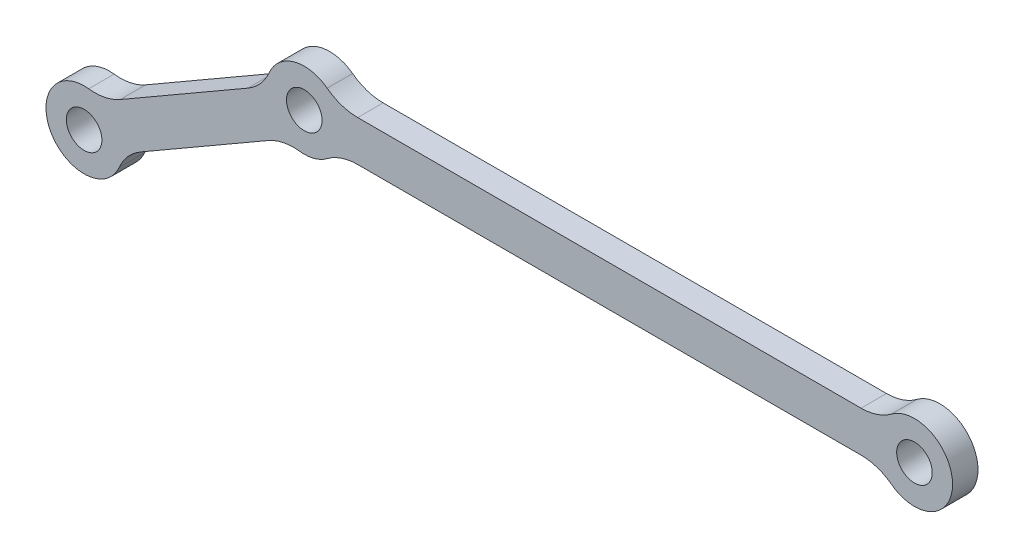
ISO-10303-21;
HEADER;
FILE_DESCRIPTION(('STEP AP214'),'2;1');
FILE_NAME('part.step','',(''),(''),'','','');
FILE_SCHEMA(('AUTOMOTIVE_DESIGN { 1 0 10303 214 1 1 1 1 }'));
ENDSEC;
DATA;
#1=APPLICATION_CONTEXT('core data for automotive mechanical design processes');
#2=APPLICATION_PROTOCOL_DEFINITION('international standard','automotive_design',2000,#1);
#3=PRODUCT_CONTEXT('',#1,'mechanical');
#4=PRODUCT('Part','Part','',(#3));
#5=PRODUCT_RELATED_PRODUCT_CATEGORY('part','',(#4));
#6=PRODUCT_DEFINITION_FORMATION('','',#4);
#7=PRODUCT_DEFINITION_CONTEXT('part definition',#1,'design');
#8=PRODUCT_DEFINITION('design','',#6,#7);
#9=PRODUCT_DEFINITION_SHAPE('','',#8);
#10=(LENGTH_UNIT() NAMED_UNIT(*) SI_UNIT(.MILLI.,.METRE.));
#11=(NAMED_UNIT(*) PLANE_ANGLE_UNIT() SI_UNIT($,.RADIAN.));
#12=(NAMED_UNIT(*) SI_UNIT($,.STERADIAN.) SOLID_ANGLE_UNIT());
#13=UNCERTAINTY_MEASURE_WITH_UNIT(LENGTH_MEASURE(1.E-05),#10,'distance_accuracy_value','');
#14=(GEOMETRIC_REPRESENTATION_CONTEXT(3) GLOBAL_UNCERTAINTY_ASSIGNED_CONTEXT((#13)) GLOBAL_UNIT_ASSIGNED_CONTEXT((#10,
#11,#12)) REPRESENTATION_CONTEXT('',''));
#15=CARTESIAN_POINT('',(0.,0.,0.));
#16=DIRECTION('',(0.,0.,1.));
#17=DIRECTION('',(1.,0.,0.));
#18=AXIS2_PLACEMENT_3D('',#15,#16,#17);
#19=CARTESIAN_POINT('',(-163.301270189222,-24.9999999999997,-5.));
#20=DIRECTION('',(0.,0.,1.));
#21=DIRECTION('',(1.,0.,0.));
#22=AXIS2_PLACEMENT_3D('',#19,#20,#21);
#23=CYLINDRICAL_SURFACE('',#22,7.49999999999999);
#24=CARTESIAN_POINT('',(-163.301270189222,-24.9999999999997,-5.));
#25=DIRECTION('',(0.,0.,1.));
#26=DIRECTION('',(1.,0.,0.));
#27=AXIS2_PLACEMENT_3D('',#24,#25,#26);
#28=CIRCLE('',#27,7.49999999999999);
#29=CARTESIAN_POINT('',(-162.404155872192,-17.5538475772931,-5.));
#30=VERTEX_POINT('',#29);
#31=CARTESIAN_POINT('',(-156.404155872192,-27.9461524227064,-5.));
#32=VERTEX_POINT('',#31);
#33=EDGE_CURVE('E277',#30,#32,#28,.T.);
#34=ORIENTED_EDGE('',*,*,#33,.T.);
#35=DIRECTION('',(0.,0.,1.));
#36=VECTOR('',#35,1.);
#37=CARTESIAN_POINT('',(-156.404155872192,-27.9461524227064,-5.));
#38=LINE('',#37,#36);
#39=CARTESIAN_POINT('',(-156.404155872192,-27.9461524227064,0.));
#40=VERTEX_POINT('',#39);
#41=EDGE_CURVE('E196',#32,#40,#38,.T.);
#42=ORIENTED_EDGE('',*,*,#41,.T.);
#43=CARTESIAN_POINT('',(-163.301270189222,-24.9999999999997,0.));
#44=DIRECTION('',(0.,0.,1.));
#45=DIRECTION('',(1.,0.,0.));
#46=AXIS2_PLACEMENT_3D('',#43,#44,#45);
#47=CIRCLE('',#46,7.49999999999999);
#48=CARTESIAN_POINT('',(-162.404155872192,-17.5538475772931,0.));
#49=VERTEX_POINT('',#48);
#50=EDGE_CURVE('E154',#49,#40,#47,.T.);
#51=ORIENTED_EDGE('',*,*,#50,.F.);
#52=DIRECTION('',(0.,0.,1.));
#53=VECTOR('',#52,1.);
#54=CARTESIAN_POINT('',(-162.404155872192,-17.5538475772931,-5.));
#55=LINE('',#54,#53);
#56=EDGE_CURVE('E194',#49,#30,#55,.F.);
#57=ORIENTED_EDGE('',*,*,#56,.T.);
#58=EDGE_LOOP('',(#34,#42,#51,#57));
#59=FACE_BOUND('',#58,.T.);
#60=ADVANCED_FACE('F35',(#59),#23,.T.);
#61=CARTESIAN_POINT('',(-127.494315243959,0.291957230025407,-5.));
#62=DIRECTION('',(-0.499999999999995,0.866025403784442,0.));
#63=DIRECTION('',(-0.866025403784442,-0.499999999999995,0.));
#64=AXIS2_PLACEMENT_3D('',#61,#62,#63);
#65=PLANE('',#64);
#66=DIRECTION('',(-0.866025403784441,-0.499999999999995,0.));
#67=VECTOR('',#66,1.);
#68=CARTESIAN_POINT('',(-127.494315243959,0.291957230025407,-5.));
#69=LINE('',#68,#67);
#70=CARTESIAN_POINT('',(-131.093266739737,-1.78589838486219,-5.));
#71=VERTEX_POINT('',#70);
#72=CARTESIAN_POINT('',(-156.208003449485,-16.285898384862,-5.));
#73=VERTEX_POINT('',#72);
#74=EDGE_CURVE('E174',#71,#73,#69,.T.);
#75=ORIENTED_EDGE('',*,*,#74,.T.);
#76=DIRECTION('',(0.,0.,-1.));
#77=VECTOR('',#76,1.);
#78=CARTESIAN_POINT('',(-156.208003449485,-16.2858983848621,0.));
#79=LINE('',#78,#77);
#80=CARTESIAN_POINT('',(-156.208003449485,-16.285898384862,0.));
#81=VERTEX_POINT('',#80);
#82=EDGE_CURVE('E200',#73,#81,#79,.F.);
#83=ORIENTED_EDGE('',*,*,#82,.T.);
#84=DIRECTION('',(-0.866025403784441,-0.499999999999995,0.));
#85=VECTOR('',#84,1.);
#86=CARTESIAN_POINT('',(-127.494315243959,0.291957230025407,0.));
#87=LINE('',#86,#85);
#88=CARTESIAN_POINT('',(-131.093266739737,-1.78589838486219,0.));
#89=VERTEX_POINT('',#88);
#90=EDGE_CURVE('E182',#89,#81,#87,.T.);
#91=ORIENTED_EDGE('',*,*,#90,.F.);
#92=DIRECTION('',(0.,0.,-1.));
#93=VECTOR('',#92,1.);
#94=CARTESIAN_POINT('',(-131.093266739737,-1.78589838486219,-5.));
#95=LINE('',#94,#93);
#96=EDGE_CURVE('E198',#89,#71,#95,.T.);
#97=ORIENTED_EDGE('',*,*,#96,.T.);
#98=EDGE_LOOP('',(#75,#83,#91,#97));
#99=FACE_BOUND('',#98,.T.);
#100=ADVANCED_FACE('F324',(#99),#65,.T.);
#101=CARTESIAN_POINT('',(-120.,0.,-5.));
#102=DIRECTION('',(0.,0.,1.));
#103=DIRECTION('',(1.,0.,0.));
#104=AXIS2_PLACEMENT_3D('',#101,#102,#103);
#105=CYLINDRICAL_SURFACE('',#104,7.49999999999999);
#106=CARTESIAN_POINT('',(-120.,0.,-5.));
#107=DIRECTION('',(0.,0.,1.));
#108=DIRECTION('',(-1.,0.,0.));
#109=AXIS2_PLACEMENT_3D('',#106,#107,#108);
#110=CIRCLE('',#109,7.49999999999999);
#111=CARTESIAN_POINT('',(-115.5,6.,-5.));
#112=VERTEX_POINT('',#111);
#113=CARTESIAN_POINT('',(-126.89711431703,2.94615242270667,-5.));
#114=VERTEX_POINT('',#113);
#115=EDGE_CURVE('E179',#112,#114,#110,.T.);
#116=ORIENTED_EDGE('',*,*,#115,.T.);
#117=DIRECTION('',(0.,0.,1.));
#118=VECTOR('',#117,1.);
#119=CARTESIAN_POINT('',(-126.89711431703,2.94615242270666,-5.));
#120=LINE('',#119,#118);
#121=CARTESIAN_POINT('',(-126.89711431703,2.94615242270667,0.));
#122=VERTEX_POINT('',#121);
#123=EDGE_CURVE('E205',#114,#122,#120,.T.);
#124=ORIENTED_EDGE('',*,*,#123,.T.);
#125=CARTESIAN_POINT('',(-120.,0.,0.));
#126=DIRECTION('',(0.,0.,1.));
#127=DIRECTION('',(-1.,0.,0.));
#128=AXIS2_PLACEMENT_3D('',#125,#126,#127);
#129=CIRCLE('',#128,7.49999999999999);
#130=CARTESIAN_POINT('',(-115.5,6.,0.));
#131=VERTEX_POINT('',#130);
#132=EDGE_CURVE('E252',#131,#122,#129,.T.);
#133=ORIENTED_EDGE('',*,*,#132,.F.);
#134=DIRECTION('',(0.,0.,1.));
#135=VECTOR('',#134,1.);
#136=CARTESIAN_POINT('',(-115.5,5.99999999999999,-5.));
#137=LINE('',#136,#135);
#138=EDGE_CURVE('E203',#131,#112,#137,.F.);
#139=ORIENTED_EDGE('',*,*,#138,.T.);
#140=EDGE_LOOP('',(#116,#124,#133,#139));
#141=FACE_BOUND('',#140,.T.);
#142=ADVANCED_FACE('F329',(#141),#105,.T.);
#143=CARTESIAN_POINT('',(-113.655711229775,4.,-5.));
#144=DIRECTION('',(0.,1.,0.));
#145=DIRECTION('',(-1.,0.,0.));
#146=AXIS2_PLACEMENT_3D('',#143,#144,#145);
#147=PLANE('',#146);
#148=DIRECTION('',(-1.,0.,0.));
#149=VECTOR('',#148,1.);
#150=CARTESIAN_POINT('',(-113.655711229775,4.,-5.));
#151=LINE('',#150,#149);
#152=CARTESIAN_POINT('',(-10.5,4.00000000000001,-5.));
#153=VERTEX_POINT('',#152);
#154=CARTESIAN_POINT('',(-109.5,4.,-5.));
#155=VERTEX_POINT('',#154);
#156=EDGE_CURVE('E257',#153,#155,#151,.T.);
#157=ORIENTED_EDGE('',*,*,#156,.T.);
#158=DIRECTION('',(0.,0.,-1.));
#159=VECTOR('',#158,1.);
#160=CARTESIAN_POINT('',(-109.5,4.,0.));
#161=LINE('',#160,#159);
#162=CARTESIAN_POINT('',(-109.5,4.,0.));
#163=VERTEX_POINT('',#162);
#164=EDGE_CURVE('E210',#155,#163,#161,.F.);
#165=ORIENTED_EDGE('',*,*,#164,.T.);
#166=DIRECTION('',(-1.,0.,0.));
#167=VECTOR('',#166,1.);
#168=CARTESIAN_POINT('',(-113.655711229775,4.,0.));
#169=LINE('',#168,#167);
#170=CARTESIAN_POINT('',(-10.5,4.00000000000001,0.));
#171=VERTEX_POINT('',#170);
#172=EDGE_CURVE('E243',#171,#163,#169,.T.);
#173=ORIENTED_EDGE('',*,*,#172,.F.);
#174=DIRECTION('',(0.,0.,-1.));
#175=VECTOR('',#174,1.);
#176=CARTESIAN_POINT('',(-10.5,4.00000000000001,-5.));
#177=LINE('',#176,#175);
#178=EDGE_CURVE('E208',#171,#153,#177,.T.);
#179=ORIENTED_EDGE('',*,*,#178,.T.);
#180=EDGE_LOOP('',(#157,#165,#173,#179));
#181=FACE_BOUND('',#180,.T.);
#182=ADVANCED_FACE('F250',(#181),#147,.T.);
#183=CARTESIAN_POINT('',(0.,0.,-5.));
#184=DIRECTION('',(0.,0.,1.));
#185=DIRECTION('',(1.,0.,0.));
#186=AXIS2_PLACEMENT_3D('',#183,#184,#185);
#187=CYLINDRICAL_SURFACE('',#186,7.5);
#188=CARTESIAN_POINT('',(0.,0.,0.));
#189=DIRECTION('',(0.,0.,1.));
#190=DIRECTION('',(1.,0.,0.));
#191=AXIS2_PLACEMENT_3D('',#188,#189,#190);
#192=CIRCLE('',#191,7.5);
#193=CARTESIAN_POINT('',(-4.50000000000001,-6.,0.));
#194=VERTEX_POINT('',#193);
#195=CARTESIAN_POINT('',(-4.5,6.00000000000001,0.));
#196=VERTEX_POINT('',#195);
#197=EDGE_CURVE('E244',#194,#196,#192,.T.);
#198=ORIENTED_EDGE('',*,*,#197,.F.);
#199=DIRECTION('',(0.,0.,1.));
#200=VECTOR('',#199,1.);
#201=CARTESIAN_POINT('',(-4.50000000000001,-6.,-5.));
#202=LINE('',#201,#200);
#203=CARTESIAN_POINT('',(-4.50000000000001,-6.,-5.));
#204=VERTEX_POINT('',#203);
#205=EDGE_CURVE('E55',#194,#204,#202,.F.);
#206=ORIENTED_EDGE('',*,*,#205,.T.);
#207=CARTESIAN_POINT('',(0.,0.,-5.));
#208=DIRECTION('',(0.,0.,1.));
#209=DIRECTION('',(1.,0.,0.));
#210=AXIS2_PLACEMENT_3D('',#207,#208,#209);
#211=CIRCLE('',#210,7.5);
#212=CARTESIAN_POINT('',(-4.5,6.00000000000001,-5.));
#213=VERTEX_POINT('',#212);
#214=EDGE_CURVE('E255',#204,#213,#211,.T.);
#215=ORIENTED_EDGE('',*,*,#214,.T.);
#216=DIRECTION('',(0.,0.,1.));
#217=VECTOR('',#216,1.);
#218=CARTESIAN_POINT('',(-4.5,6.00000000000001,-5.));
#219=LINE('',#218,#217);
#220=EDGE_CURVE('E213',#213,#196,#219,.T.);
#221=ORIENTED_EDGE('',*,*,#220,.T.);
#222=EDGE_LOOP('',(#198,#206,#215,#221));
#223=FACE_BOUND('',#222,.T.);
#224=ADVANCED_FACE('F254',(#223),#187,.T.);
#225=CARTESIAN_POINT('',(-113.655711229775,-4.,-5.));
#226=DIRECTION('',(0.,-1.,0.));
#227=DIRECTION('',(1.,0.,0.));
#228=AXIS2_PLACEMENT_3D('',#225,#226,#227);
#229=PLANE('',#228);
#230=DIRECTION('',(1.,0.,0.));
#231=VECTOR('',#230,1.);
#232=CARTESIAN_POINT('',(-113.655711229775,-4.,0.));
#233=LINE('',#232,#231);
#234=CARTESIAN_POINT('',(-109.5,-4.,0.));
#235=VERTEX_POINT('',#234);
#236=CARTESIAN_POINT('',(-10.5000000000001,-3.99999999999999,0.));
#237=VERTEX_POINT('',#236);
#238=EDGE_CURVE('E272',#235,#237,#233,.T.);
#239=ORIENTED_EDGE('',*,*,#238,.F.);
#240=DIRECTION('',(0.,0.,-1.));
#241=VECTOR('',#240,1.);
#242=CARTESIAN_POINT('',(-109.5,-4.,-5.));
#243=LINE('',#242,#241);
#244=CARTESIAN_POINT('',(-109.5,-4.,-5.));
#245=VERTEX_POINT('',#244);
#246=EDGE_CURVE('E192',#235,#245,#243,.T.);
#247=ORIENTED_EDGE('',*,*,#246,.T.);
#248=DIRECTION('',(1.,0.,0.));
#249=VECTOR('',#248,1.);
#250=CARTESIAN_POINT('',(-113.655711229775,-4.,-5.));
#251=LINE('',#250,#249);
#252=CARTESIAN_POINT('',(-10.5000000000001,-3.99999999999999,-5.));
#253=VERTEX_POINT('',#252);
#254=EDGE_CURVE('E258',#245,#253,#251,.T.);
#255=ORIENTED_EDGE('',*,*,#254,.T.);
#256=DIRECTION('',(0.,0.,-1.));
#257=VECTOR('',#256,1.);
#258=CARTESIAN_POINT('',(-10.5,-3.99999999999999,0.));
#259=LINE('',#258,#257);
#260=EDGE_CURVE('E189',#253,#237,#259,.F.);
#261=ORIENTED_EDGE('',*,*,#260,.T.);
#262=EDGE_LOOP('',(#239,#247,#255,#261));
#263=FACE_BOUND('',#262,.T.);
#264=ADVANCED_FACE('F302',(#263),#229,.T.);
#265=CARTESIAN_POINT('',(-120.,0.,-5.));
#266=DIRECTION('',(0.,0.,1.));
#267=DIRECTION('',(1.,0.,0.));
#268=AXIS2_PLACEMENT_3D('',#265,#266,#267);
#269=CYLINDRICAL_SURFACE('',#268,7.49999999999999);
#270=CARTESIAN_POINT('',(-120.,0.,0.));
#271=DIRECTION('',(0.,0.,1.));
#272=DIRECTION('',(1.,0.,0.));
#273=AXIS2_PLACEMENT_3D('',#270,#271,#272);
#274=CIRCLE('',#273,7.49999999999999);
#275=CARTESIAN_POINT('',(-120.89711431703,-7.44615242270663,0.));
#276=VERTEX_POINT('',#275);
#277=CARTESIAN_POINT('',(-115.5,-6.,0.));
#278=VERTEX_POINT('',#277);
#279=EDGE_CURVE('E170',#276,#278,#274,.T.);
#280=ORIENTED_EDGE('',*,*,#279,.F.);
#281=DIRECTION('',(0.,0.,1.));
#282=VECTOR('',#281,1.);
#283=CARTESIAN_POINT('',(-120.89711431703,-7.44615242270664,-5.));
#284=LINE('',#283,#282);
#285=CARTESIAN_POINT('',(-120.89711431703,-7.44615242270663,-5.));
#286=VERTEX_POINT('',#285);
#287=EDGE_CURVE('E187',#276,#286,#284,.F.);
#288=ORIENTED_EDGE('',*,*,#287,.T.);
#289=CARTESIAN_POINT('',(-120.,0.,-5.));
#290=DIRECTION('',(0.,0.,1.));
#291=DIRECTION('',(1.,0.,0.));
#292=AXIS2_PLACEMENT_3D('',#289,#290,#291);
#293=CIRCLE('',#292,7.49999999999999);
#294=CARTESIAN_POINT('',(-115.5,-6.,-5.));
#295=VERTEX_POINT('',#294);
#296=EDGE_CURVE('E262',#286,#295,#293,.T.);
#297=ORIENTED_EDGE('',*,*,#296,.T.);
#298=DIRECTION('',(0.,0.,1.));
#299=VECTOR('',#298,1.);
#300=CARTESIAN_POINT('',(-115.5,-6.,-5.));
#301=LINE('',#300,#299);
#302=EDGE_CURVE('E176',#295,#278,#301,.T.);
#303=ORIENTED_EDGE('',*,*,#302,.T.);
#304=EDGE_LOOP('',(#280,#288,#297,#303));
#305=FACE_BOUND('',#304,.T.);
#306=ADVANCED_FACE('F293',(#305),#269,.T.);
#307=CARTESIAN_POINT('',(-155.806954945263,-25.2919572300252,-5.));
#308=DIRECTION('',(0.499999999999995,-0.866025403784441,0.));
#309=DIRECTION('',(0.866025403784441,0.499999999999995,0.));
#310=AXIS2_PLACEMENT_3D('',#307,#308,#309);
#311=PLANE('',#310);
#312=DIRECTION('',(0.866025403784441,0.499999999999995,0.));
#313=VECTOR('',#312,1.);
#314=CARTESIAN_POINT('',(-155.806954945263,-25.2919572300252,-5.));
#315=LINE('',#314,#313);
#316=CARTESIAN_POINT('',(-152.208003449485,-23.2141016151376,-5.));
#317=VERTEX_POINT('',#316);
#318=CARTESIAN_POINT('',(-127.093266739737,-8.71410161513772,-5.));
#319=VERTEX_POINT('',#318);
#320=EDGE_CURVE('E280',#317,#319,#315,.T.);
#321=ORIENTED_EDGE('',*,*,#320,.T.);
#322=DIRECTION('',(0.,0.,-1.));
#323=VECTOR('',#322,1.);
#324=CARTESIAN_POINT('',(-127.093266739737,-8.71410161513772,0.));
#325=LINE('',#324,#323);
#326=CARTESIAN_POINT('',(-127.093266739737,-8.71410161513772,0.));
#327=VERTEX_POINT('',#326);
#328=EDGE_CURVE('E169',#319,#327,#325,.F.);
#329=ORIENTED_EDGE('',*,*,#328,.T.);
#330=DIRECTION('',(0.866025403784441,0.499999999999995,0.));
#331=VECTOR('',#330,1.);
#332=CARTESIAN_POINT('',(-155.806954945263,-25.2919572300252,0.));
#333=LINE('',#332,#331);
#334=CARTESIAN_POINT('',(-152.208003449485,-23.2141016151376,0.));
#335=VERTEX_POINT('',#334);
#336=EDGE_CURVE('E152',#335,#327,#333,.T.);
#337=ORIENTED_EDGE('',*,*,#336,.F.);
#338=DIRECTION('',(0.,0.,-1.));
#339=VECTOR('',#338,1.);
#340=CARTESIAN_POINT('',(-152.208003449485,-23.2141016151376,-5.));
#341=LINE('',#340,#339);
#342=EDGE_CURVE('E166',#335,#317,#341,.T.);
#343=ORIENTED_EDGE('',*,*,#342,.T.);
#344=EDGE_LOOP('',(#321,#329,#337,#343));
#345=FACE_BOUND('',#344,.T.);
#346=ADVANCED_FACE('F165',(#345),#311,.T.);
#347=CARTESIAN_POINT('',(-163.301270189222,-24.9999999999997,-5.));
#348=DIRECTION('',(0.,0.,1.));
#349=DIRECTION('',(1.,0.,0.));
#350=AXIS2_PLACEMENT_3D('',#347,#348,#349);
#351=PLANE('',#350);
#352=CARTESIAN_POINT('',(-163.301270189222,-24.9999999999997,-5.));
#353=DIRECTION('',(0.,0.,1.));
#354=DIRECTION('',(1.,0.,0.));
#355=AXIS2_PLACEMENT_3D('',#352,#353,#354);
#356=CIRCLE('',#355,3.49999999999999);
#357=CARTESIAN_POINT('',(-159.801270189222,-24.9999999999997,-5.));
#358=VERTEX_POINT('',#357);
#359=EDGE_CURVE('E535',#358,#358,#356,.T.);
#360=ORIENTED_EDGE('',*,*,#359,.T.);
#361=EDGE_LOOP('',(#360));
#362=FACE_BOUND('',#361,.T.);
#363=CARTESIAN_POINT('',(-120.,0.,-5.));
#364=DIRECTION('',(0.,0.,1.));
#365=DIRECTION('',(1.,0.,0.));
#366=AXIS2_PLACEMENT_3D('',#363,#364,#365);
#367=CIRCLE('',#366,3.50000000000001);
#368=CARTESIAN_POINT('',(-116.5,0.,-5.));
#369=VERTEX_POINT('',#368);
#370=EDGE_CURVE('E529',#369,#369,#367,.T.);
#371=ORIENTED_EDGE('',*,*,#370,.T.);
#372=EDGE_LOOP('',(#371));
#373=FACE_BOUND('',#372,.T.);
#374=CARTESIAN_POINT('',(0.,0.,-5.));
#375=DIRECTION('',(0.,0.,1.));
#376=DIRECTION('',(1.,0.,0.));
#377=AXIS2_PLACEMENT_3D('',#374,#375,#376);
#378=CIRCLE('',#377,3.5);
#379=CARTESIAN_POINT('',(3.5,0.,-5.));
#380=VERTEX_POINT('',#379);
#381=EDGE_CURVE('E268',#380,#380,#378,.T.);
#382=ORIENTED_EDGE('',*,*,#381,.T.);
#383=EDGE_LOOP('',(#382));
#384=FACE_BOUND('',#383,.T.);
#385=ORIENTED_EDGE('',*,*,#33,.F.);
#386=CARTESIAN_POINT('',(-161.208003449485,-7.62564434701763,-5.));
#387=DIRECTION('',(0.,0.,1.));
#388=DIRECTION('',(1.,0.,0.));
#389=AXIS2_PLACEMENT_3D('',#386,#387,#388);
#390=CIRCLE('',#389,10.);
#391=EDGE_CURVE('E227',#30,#73,#390,.T.);
#392=ORIENTED_EDGE('',*,*,#391,.T.);
#393=ORIENTED_EDGE('',*,*,#74,.F.);
#394=CARTESIAN_POINT('',(-136.093266739737,6.87435565298222,-5.));
#395=DIRECTION('',(0.,0.,1.));
#396=DIRECTION('',(1.,0.,0.));
#397=AXIS2_PLACEMENT_3D('',#394,#395,#396);
#398=CIRCLE('',#397,10.);
#399=EDGE_CURVE('E231',#71,#114,#398,.T.);
#400=ORIENTED_EDGE('',*,*,#399,.T.);
#401=ORIENTED_EDGE('',*,*,#115,.F.);
#402=CARTESIAN_POINT('',(-109.5,14.,-5.));
#403=DIRECTION('',(0.,0.,1.));
#404=DIRECTION('',(1.,0.,0.));
#405=AXIS2_PLACEMENT_3D('',#402,#403,#404);
#406=CIRCLE('',#405,10.);
#407=EDGE_CURVE('E235',#112,#155,#406,.T.);
#408=ORIENTED_EDGE('',*,*,#407,.T.);
#409=ORIENTED_EDGE('',*,*,#156,.F.);
#410=CARTESIAN_POINT('',(-10.5,14.,-5.));
#411=DIRECTION('',(0.,0.,1.));
#412=DIRECTION('',(1.,0.,0.));
#413=AXIS2_PLACEMENT_3D('',#410,#411,#412);
#414=CIRCLE('',#413,10.);
#415=EDGE_CURVE('E11',#153,#213,#414,.T.);
#416=ORIENTED_EDGE('',*,*,#415,.T.);
#417=ORIENTED_EDGE('',*,*,#214,.F.);
#418=CARTESIAN_POINT('',(-10.5,-14.,-5.));
#419=DIRECTION('',(0.,0.,1.));
#420=DIRECTION('',(1.,0.,0.));
#421=AXIS2_PLACEMENT_3D('',#418,#419,#420);
#422=CIRCLE('',#421,10.);
#423=EDGE_CURVE('E239',#204,#253,#422,.T.);
#424=ORIENTED_EDGE('',*,*,#423,.T.);
#425=ORIENTED_EDGE('',*,*,#254,.F.);
#426=CARTESIAN_POINT('',(-109.5,-14.,-5.));
#427=DIRECTION('',(0.,0.,1.));
#428=DIRECTION('',(1.,0.,0.));
#429=AXIS2_PLACEMENT_3D('',#426,#427,#428);
#430=CIRCLE('',#429,10.);
#431=EDGE_CURVE('E160',#245,#295,#430,.T.);
#432=ORIENTED_EDGE('',*,*,#431,.T.);
#433=ORIENTED_EDGE('',*,*,#296,.F.);
#434=CARTESIAN_POINT('',(-122.093266739737,-17.3743556529821,-5.));
#435=DIRECTION('',(0.,0.,1.));
#436=DIRECTION('',(1.,0.,0.));
#437=AXIS2_PLACEMENT_3D('',#434,#435,#436);
#438=CIRCLE('',#437,10.);
#439=EDGE_CURVE('E219',#286,#319,#438,.T.);
#440=ORIENTED_EDGE('',*,*,#439,.T.);
#441=ORIENTED_EDGE('',*,*,#320,.F.);
#442=CARTESIAN_POINT('',(-147.208003449486,-31.874355652982,-5.));
#443=DIRECTION('',(0.,0.,1.));
#444=DIRECTION('',(1.,0.,0.));
#445=AXIS2_PLACEMENT_3D('',#442,#443,#444);
#446=CIRCLE('',#445,10.);
#447=EDGE_CURVE('E159',#317,#32,#446,.T.);
#448=ORIENTED_EDGE('',*,*,#447,.T.);
#449=EDGE_LOOP('',(#385,#392,#393,#400,#401,#408,#409,#416,#417,#424,#425,#432,#433,#440,#441,#448));
#450=FACE_BOUND('',#449,.T.);
#451=ADVANCED_FACE('F307',(#362,#373,#384,#450),#351,.F.);
#452=CARTESIAN_POINT('',(-163.301270189222,-24.9999999999997,0.));
#453=DIRECTION('',(0.,0.,1.));
#454=DIRECTION('',(1.,0.,0.));
#455=AXIS2_PLACEMENT_3D('',#452,#453,#454);
#456=PLANE('',#455);
#457=CARTESIAN_POINT('',(-163.301270189222,-24.9999999999997,0.));
#458=DIRECTION('',(0.,0.,1.));
#459=DIRECTION('',(1.,0.,0.));
#460=AXIS2_PLACEMENT_3D('',#457,#458,#459);
#461=CIRCLE('',#460,3.49999999999999);
#462=CARTESIAN_POINT('',(-159.801270189222,-24.9999999999997,0.));
#463=VERTEX_POINT('',#462);
#464=EDGE_CURVE('E538',#463,#463,#461,.T.);
#465=ORIENTED_EDGE('',*,*,#464,.F.);
#466=EDGE_LOOP('',(#465));
#467=FACE_BOUND('',#466,.T.);
#468=CARTESIAN_POINT('',(-120.,0.,0.));
#469=DIRECTION('',(0.,0.,1.));
#470=DIRECTION('',(1.,0.,0.));
#471=AXIS2_PLACEMENT_3D('',#468,#469,#470);
#472=CIRCLE('',#471,3.50000000000001);
#473=CARTESIAN_POINT('',(-116.5,0.,0.));
#474=VERTEX_POINT('',#473);
#475=EDGE_CURVE('E531',#474,#474,#472,.T.);
#476=ORIENTED_EDGE('',*,*,#475,.F.);
#477=EDGE_LOOP('',(#476));
#478=FACE_BOUND('',#477,.T.);
#479=CARTESIAN_POINT('',(0.,0.,0.));
#480=DIRECTION('',(0.,0.,1.));
#481=DIRECTION('',(1.,0.,0.));
#482=AXIS2_PLACEMENT_3D('',#479,#480,#481);
#483=CIRCLE('',#482,3.5);
#484=CARTESIAN_POINT('',(3.5,0.,0.));
#485=VERTEX_POINT('',#484);
#486=EDGE_CURVE('E286',#485,#485,#483,.T.);
#487=ORIENTED_EDGE('',*,*,#486,.F.);
#488=EDGE_LOOP('',(#487));
#489=FACE_BOUND('',#488,.T.);
#490=ORIENTED_EDGE('',*,*,#90,.T.);
#491=CARTESIAN_POINT('',(-161.208003449485,-7.62564434701763,0.));
#492=DIRECTION('',(0.,0.,1.));
#493=DIRECTION('',(1.,0.,0.));
#494=AXIS2_PLACEMENT_3D('',#491,#492,#493);
#495=CIRCLE('',#494,10.);
#496=EDGE_CURVE('E225',#81,#49,#495,.F.);
#497=ORIENTED_EDGE('',*,*,#496,.T.);
#498=ORIENTED_EDGE('',*,*,#50,.T.);
#499=CARTESIAN_POINT('',(-147.208003449486,-31.874355652982,0.));
#500=DIRECTION('',(0.,0.,1.));
#501=DIRECTION('',(1.,0.,0.));
#502=AXIS2_PLACEMENT_3D('',#499,#500,#501);
#503=CIRCLE('',#502,10.);
#504=EDGE_CURVE('E148',#40,#335,#503,.F.);
#505=ORIENTED_EDGE('',*,*,#504,.T.);
#506=ORIENTED_EDGE('',*,*,#336,.T.);
#507=CARTESIAN_POINT('',(-122.093266739737,-17.3743556529821,0.));
#508=DIRECTION('',(0.,0.,1.));
#509=DIRECTION('',(1.,0.,0.));
#510=AXIS2_PLACEMENT_3D('',#507,#508,#509);
#511=CIRCLE('',#510,10.);
#512=EDGE_CURVE('E217',#327,#276,#511,.F.);
#513=ORIENTED_EDGE('',*,*,#512,.T.);
#514=ORIENTED_EDGE('',*,*,#279,.T.);
#515=CARTESIAN_POINT('',(-109.5,-14.,0.));
#516=DIRECTION('',(0.,0.,1.));
#517=DIRECTION('',(1.,0.,0.));
#518=AXIS2_PLACEMENT_3D('',#515,#516,#517);
#519=CIRCLE('',#518,10.);
#520=EDGE_CURVE('E221',#278,#235,#519,.F.);
#521=ORIENTED_EDGE('',*,*,#520,.T.);
#522=ORIENTED_EDGE('',*,*,#238,.T.);
#523=CARTESIAN_POINT('',(-10.5,-14.,0.));
#524=DIRECTION('',(0.,0.,1.));
#525=DIRECTION('',(1.,0.,0.));
#526=AXIS2_PLACEMENT_3D('',#523,#524,#525);
#527=CIRCLE('',#526,10.);
#528=EDGE_CURVE('E237',#237,#194,#527,.F.);
#529=ORIENTED_EDGE('',*,*,#528,.T.);
#530=ORIENTED_EDGE('',*,*,#197,.T.);
#531=CARTESIAN_POINT('',(-10.5,14.,0.));
#532=DIRECTION('',(0.,0.,1.));
#533=DIRECTION('',(1.,0.,0.));
#534=AXIS2_PLACEMENT_3D('',#531,#532,#533);
#535=CIRCLE('',#534,10.);
#536=EDGE_CURVE('E43',#196,#171,#535,.F.);
#537=ORIENTED_EDGE('',*,*,#536,.T.);
#538=ORIENTED_EDGE('',*,*,#172,.T.);
#539=CARTESIAN_POINT('',(-109.5,14.,0.));
#540=DIRECTION('',(0.,0.,1.));
#541=DIRECTION('',(1.,0.,0.));
#542=AXIS2_PLACEMENT_3D('',#539,#540,#541);
#543=CIRCLE('',#542,10.);
#544=EDGE_CURVE('E233',#163,#131,#543,.F.);
#545=ORIENTED_EDGE('',*,*,#544,.T.);
#546=ORIENTED_EDGE('',*,*,#132,.T.);
#547=CARTESIAN_POINT('',(-136.093266739737,6.87435565298222,0.));
#548=DIRECTION('',(0.,0.,1.));
#549=DIRECTION('',(1.,0.,0.));
#550=AXIS2_PLACEMENT_3D('',#547,#548,#549);
#551=CIRCLE('',#550,10.);
#552=EDGE_CURVE('E229',#122,#89,#551,.F.);
#553=ORIENTED_EDGE('',*,*,#552,.T.);
#554=EDGE_LOOP('',(#490,#497,#498,#505,#506,#513,#514,#521,#522,#529,#530,#537,#538,#545,#546,#553));
#555=FACE_BOUND('',#554,.T.);
#556=ADVANCED_FACE('F151',(#467,#478,#489,#555),#456,.T.);
#557=CARTESIAN_POINT('',(0.,0.,-5.));
#558=DIRECTION('',(0.,0.,1.));
#559=DIRECTION('',(1.,0.,0.));
#560=AXIS2_PLACEMENT_3D('',#557,#558,#559);
#561=CYLINDRICAL_SURFACE('',#560,3.5);
#562=ORIENTED_EDGE('',*,*,#381,.F.);
#563=EDGE_LOOP('',(#562));
#564=FACE_BOUND('',#563,.T.);
#565=ORIENTED_EDGE('',*,*,#486,.T.);
#566=EDGE_LOOP('',(#565));
#567=FACE_BOUND('',#566,.T.);
#568=ADVANCED_FACE('F316',(#564,#567),#561,.F.);
#569=CARTESIAN_POINT('',(-120.,0.,-5.));
#570=DIRECTION('',(0.,0.,1.));
#571=DIRECTION('',(1.,0.,0.));
#572=AXIS2_PLACEMENT_3D('',#569,#570,#571);
#573=CYLINDRICAL_SURFACE('',#572,3.50000000000001);
#574=ORIENTED_EDGE('',*,*,#370,.F.);
#575=EDGE_LOOP('',(#574));
#576=FACE_BOUND('',#575,.T.);
#577=ORIENTED_EDGE('',*,*,#475,.T.);
#578=EDGE_LOOP('',(#577));
#579=FACE_BOUND('',#578,.T.);
#580=ADVANCED_FACE('F487',(#576,#579),#573,.F.);
#581=CARTESIAN_POINT('',(-163.301270189222,-24.9999999999997,-5.));
#582=DIRECTION('',(0.,0.,1.));
#583=DIRECTION('',(1.,0.,0.));
#584=AXIS2_PLACEMENT_3D('',#581,#582,#583);
#585=CYLINDRICAL_SURFACE('',#584,3.49999999999999);
#586=ORIENTED_EDGE('',*,*,#359,.F.);
#587=EDGE_LOOP('',(#586));
#588=FACE_BOUND('',#587,.T.);
#589=ORIENTED_EDGE('',*,*,#464,.T.);
#590=EDGE_LOOP('',(#589));
#591=FACE_BOUND('',#590,.T.);
#592=ADVANCED_FACE('F337',(#588,#591),#585,.F.);
#593=CARTESIAN_POINT('',(-122.093266739737,-17.3743556529821,-5.));
#594=DIRECTION('',(0.,0.,1.));
#595=DIRECTION('',(1.,0.,0.));
#596=AXIS2_PLACEMENT_3D('',#593,#594,#595);
#597=CYLINDRICAL_SURFACE('',#596,10.);
#598=ORIENTED_EDGE('',*,*,#439,.F.);
#599=ORIENTED_EDGE('',*,*,#287,.F.);
#600=ORIENTED_EDGE('',*,*,#512,.F.);
#601=ORIENTED_EDGE('',*,*,#328,.F.);
#602=EDGE_LOOP('',(#598,#599,#600,#601));
#603=FACE_BOUND('',#602,.T.);
#604=ADVANCED_FACE('F334',(#603),#597,.F.);
#605=CARTESIAN_POINT('',(-109.5,-14.,-5.));
#606=DIRECTION('',(0.,0.,1.));
#607=DIRECTION('',(1.,0.,0.));
#608=AXIS2_PLACEMENT_3D('',#605,#606,#607);
#609=CYLINDRICAL_SURFACE('',#608,10.);
#610=ORIENTED_EDGE('',*,*,#431,.F.);
#611=ORIENTED_EDGE('',*,*,#246,.F.);
#612=ORIENTED_EDGE('',*,*,#520,.F.);
#613=ORIENTED_EDGE('',*,*,#302,.F.);
#614=EDGE_LOOP('',(#610,#611,#612,#613));
#615=FACE_BOUND('',#614,.T.);
#616=ADVANCED_FACE('F298',(#615),#609,.F.);
#617=CARTESIAN_POINT('',(-147.208003449486,-31.874355652982,-5.));
#618=DIRECTION('',(0.,0.,1.));
#619=DIRECTION('',(1.,0.,0.));
#620=AXIS2_PLACEMENT_3D('',#617,#618,#619);
#621=CYLINDRICAL_SURFACE('',#620,10.);
#622=ORIENTED_EDGE('',*,*,#447,.F.);
#623=ORIENTED_EDGE('',*,*,#342,.F.);
#624=ORIENTED_EDGE('',*,*,#504,.F.);
#625=ORIENTED_EDGE('',*,*,#41,.F.);
#626=EDGE_LOOP('',(#622,#623,#624,#625));
#627=FACE_BOUND('',#626,.T.);
#628=ADVANCED_FACE('F173',(#627),#621,.F.);
#629=CARTESIAN_POINT('',(-161.208003449485,-7.62564434701763,-5.));
#630=DIRECTION('',(0.,0.,1.));
#631=DIRECTION('',(1.,0.,0.));
#632=AXIS2_PLACEMENT_3D('',#629,#630,#631);
#633=CYLINDRICAL_SURFACE('',#632,10.);
#634=ORIENTED_EDGE('',*,*,#391,.F.);
#635=ORIENTED_EDGE('',*,*,#56,.F.);
#636=ORIENTED_EDGE('',*,*,#496,.F.);
#637=ORIENTED_EDGE('',*,*,#82,.F.);
#638=EDGE_LOOP('',(#634,#635,#636,#637));
#639=FACE_BOUND('',#638,.T.);
#640=ADVANCED_FACE('F343',(#639),#633,.F.);
#641=CARTESIAN_POINT('',(-136.093266739737,6.87435565298222,-5.));
#642=DIRECTION('',(0.,0.,1.));
#643=DIRECTION('',(1.,0.,0.));
#644=AXIS2_PLACEMENT_3D('',#641,#642,#643);
#645=CYLINDRICAL_SURFACE('',#644,10.);
#646=ORIENTED_EDGE('',*,*,#399,.F.);
#647=ORIENTED_EDGE('',*,*,#96,.F.);
#648=ORIENTED_EDGE('',*,*,#552,.F.);
#649=ORIENTED_EDGE('',*,*,#123,.F.);
#650=EDGE_LOOP('',(#646,#647,#648,#649));
#651=FACE_BOUND('',#650,.T.);
#652=ADVANCED_FACE('F346',(#651),#645,.F.);
#653=CARTESIAN_POINT('',(-109.5,14.,-5.));
#654=DIRECTION('',(0.,0.,1.));
#655=DIRECTION('',(1.,0.,0.));
#656=AXIS2_PLACEMENT_3D('',#653,#654,#655);
#657=CYLINDRICAL_SURFACE('',#656,10.);
#658=ORIENTED_EDGE('',*,*,#407,.F.);
#659=ORIENTED_EDGE('',*,*,#138,.F.);
#660=ORIENTED_EDGE('',*,*,#544,.F.);
#661=ORIENTED_EDGE('',*,*,#164,.F.);
#662=EDGE_LOOP('',(#658,#659,#660,#661));
#663=FACE_BOUND('',#662,.T.);
#664=ADVANCED_FACE('F350',(#663),#657,.F.);
#665=CARTESIAN_POINT('',(-10.5,-14.,-5.));
#666=DIRECTION('',(0.,0.,1.));
#667=DIRECTION('',(1.,0.,0.));
#668=AXIS2_PLACEMENT_3D('',#665,#666,#667);
#669=CYLINDRICAL_SURFACE('',#668,10.);
#670=ORIENTED_EDGE('',*,*,#423,.F.);
#671=ORIENTED_EDGE('',*,*,#205,.F.);
#672=ORIENTED_EDGE('',*,*,#528,.F.);
#673=ORIENTED_EDGE('',*,*,#260,.F.);
#674=EDGE_LOOP('',(#670,#671,#672,#673));
#675=FACE_BOUND('',#674,.T.);
#676=ADVANCED_FACE('F306',(#675),#669,.F.);
#677=CARTESIAN_POINT('',(-10.5,14.,-5.));
#678=DIRECTION('',(0.,0.,1.));
#679=DIRECTION('',(1.,0.,0.));
#680=AXIS2_PLACEMENT_3D('',#677,#678,#679);
#681=CYLINDRICAL_SURFACE('',#680,10.);
#682=ORIENTED_EDGE('',*,*,#415,.F.);
#683=ORIENTED_EDGE('',*,*,#178,.F.);
#684=ORIENTED_EDGE('',*,*,#536,.F.);
#685=ORIENTED_EDGE('',*,*,#220,.F.);
#686=EDGE_LOOP('',(#682,#683,#684,#685));
#687=FACE_BOUND('',#686,.T.);
#688=ADVANCED_FACE('F37',(#687),#681,.F.);
#689=CLOSED_SHELL('',(#60,#100,#142,#182,#224,#264,#306,#346,#451,#556,#568,#580,#592,#604,#616,
#628,#640,#652,#664,#676,#688));
#690=MANIFOLD_SOLID_BREP('B2',#689);
#691=ADVANCED_BREP_SHAPE_REPRESENTATION('',(#18,#690),#14);
#692=SHAPE_DEFINITION_REPRESENTATION(#9,#691);
ENDSEC;
END-ISO-10303-21;
